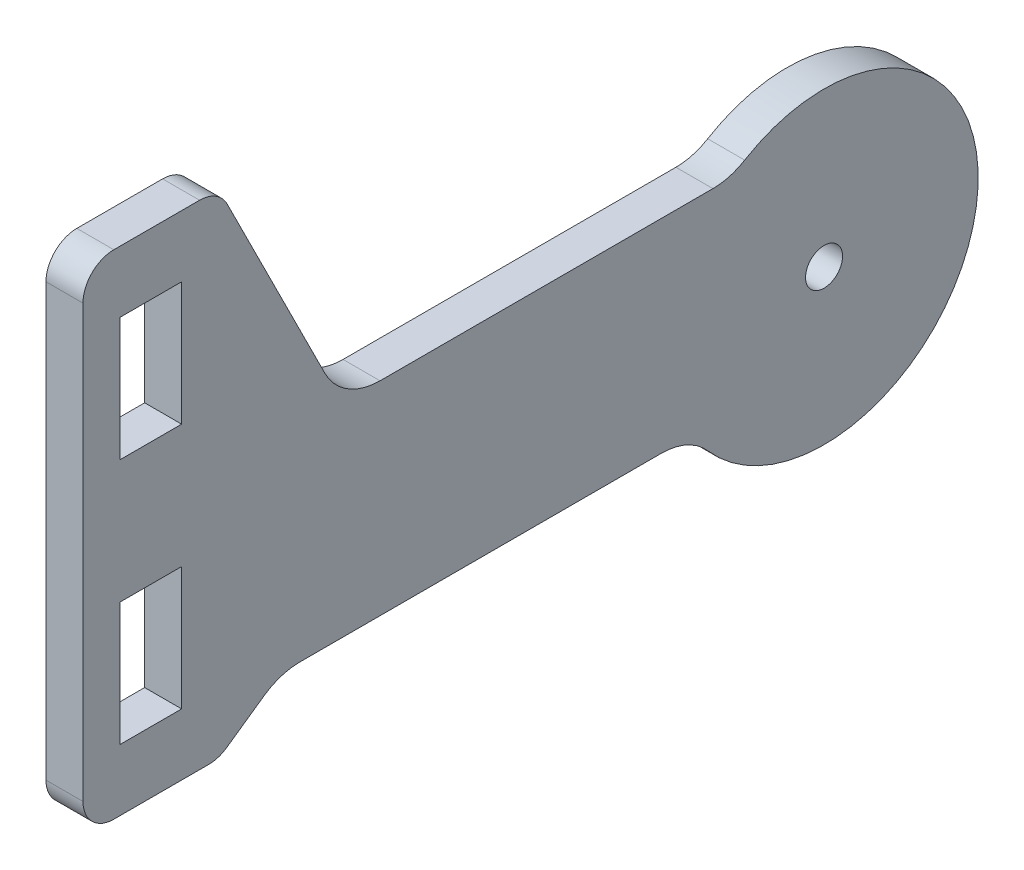
ISO-10303-21;
HEADER;
FILE_DESCRIPTION(('STEP AP214'),'2;1');
FILE_NAME('part.step','',(''),(''),'','','');
FILE_SCHEMA(('AUTOMOTIVE_DESIGN { 1 0 10303 214 1 1 1 1 }'));
ENDSEC;
DATA;
#1=APPLICATION_CONTEXT('core data for automotive mechanical design processes');
#2=APPLICATION_PROTOCOL_DEFINITION('international standard','automotive_design',2000,#1);
#3=PRODUCT_CONTEXT('',#1,'mechanical');
#4=PRODUCT('Part','Part','',(#3));
#5=PRODUCT_RELATED_PRODUCT_CATEGORY('part','',(#4));
#6=PRODUCT_DEFINITION_FORMATION('','',#4);
#7=PRODUCT_DEFINITION_CONTEXT('part definition',#1,'design');
#8=PRODUCT_DEFINITION('design','',#6,#7);
#9=PRODUCT_DEFINITION_SHAPE('','',#8);
#10=(LENGTH_UNIT() NAMED_UNIT(*) SI_UNIT(.MILLI.,.METRE.));
#11=(NAMED_UNIT(*) PLANE_ANGLE_UNIT() SI_UNIT($,.RADIAN.));
#12=(NAMED_UNIT(*) SI_UNIT($,.STERADIAN.) SOLID_ANGLE_UNIT());
#13=UNCERTAINTY_MEASURE_WITH_UNIT(LENGTH_MEASURE(1.E-05),#10,'distance_accuracy_value','');
#14=(GEOMETRIC_REPRESENTATION_CONTEXT(3) GLOBAL_UNCERTAINTY_ASSIGNED_CONTEXT((#13)) GLOBAL_UNIT_ASSIGNED_CONTEXT((#10,
#11,#12)) REPRESENTATION_CONTEXT('',''));
#15=CARTESIAN_POINT('',(0.,0.,0.));
#16=DIRECTION('',(0.,0.,1.));
#17=DIRECTION('',(1.,0.,0.));
#18=AXIS2_PLACEMENT_3D('',#15,#16,#17);
#19=CARTESIAN_POINT('',(1.5,-7.5,49.8880555770477));
#20=DIRECTION('',(1.,0.,0.));
#21=DIRECTION('',(0.,0.,-1.));
#22=AXIS2_PLACEMENT_3D('',#19,#20,#21);
#23=CYLINDRICAL_SURFACE('',#22,2.5);
#24=CARTESIAN_POINT('',(-1.5,-7.5,49.8880555770477));
#25=DIRECTION('',(1.,0.,0.));
#26=DIRECTION('',(0.,0.,-1.));
#27=AXIS2_PLACEMENT_3D('',#24,#25,#26);
#28=CIRCLE('',#27,2.5);
#29=CARTESIAN_POINT('',(-1.5,-10.,49.8880555770477));
#30=VERTEX_POINT('',#29);
#31=CARTESIAN_POINT('',(-1.5,-9.5480798012976,48.4543997161394));
#32=VERTEX_POINT('',#31);
#33=EDGE_CURVE('E11',#30,#32,#28,.T.);
#34=ORIENTED_EDGE('',*,*,#33,.T.);
#35=DIRECTION('',(1.,0.,0.));
#36=VECTOR('',#35,1.);
#37=CARTESIAN_POINT('',(1.5,-9.5480798012976,48.4543997161394));
#38=LINE('',#37,#36);
#39=CARTESIAN_POINT('',(1.5,-9.5480798012976,48.4543997161394));
#40=VERTEX_POINT('',#39);
#41=EDGE_CURVE('E24',#32,#40,#38,.T.);
#42=ORIENTED_EDGE('',*,*,#41,.T.);
#43=CARTESIAN_POINT('',(1.5,-7.5,49.8880555770477));
#44=DIRECTION('',(1.,0.,0.));
#45=DIRECTION('',(0.,0.,-1.));
#46=AXIS2_PLACEMENT_3D('',#43,#44,#45);
#47=CIRCLE('',#46,2.5);
#48=CARTESIAN_POINT('',(1.5,-10.,49.8880555770477));
#49=VERTEX_POINT('',#48);
#50=EDGE_CURVE('E375',#40,#49,#47,.F.);
#51=ORIENTED_EDGE('',*,*,#50,.T.);
#52=DIRECTION('',(1.,0.,0.));
#53=VECTOR('',#52,1.);
#54=CARTESIAN_POINT('',(1.5,-10.,49.8880555770477));
#55=LINE('',#54,#53);
#56=EDGE_CURVE('E372',#30,#49,#55,.T.);
#57=ORIENTED_EDGE('',*,*,#56,.F.);
#58=EDGE_LOOP('',(#34,#42,#51,#57));
#59=FACE_BOUND('',#58,.T.);
#60=ADVANCED_FACE('F17',(#59),#23,.T.);
#61=CARTESIAN_POINT('',(-1.5,0.,0.));
#62=DIRECTION('',(1.,0.,0.));
#63=DIRECTION('',(0.,0.,-1.));
#64=AXIS2_PLACEMENT_3D('',#61,#62,#63);
#65=PLANE('',#64);
#66=CARTESIAN_POINT('',(-1.5,0.,0.));
#67=DIRECTION('',(-1.,0.,0.));
#68=DIRECTION('',(0.,0.,1.));
#69=AXIS2_PLACEMENT_3D('',#66,#67,#68);
#70=CIRCLE('',#69,1.5);
#71=CARTESIAN_POINT('',(-1.5,0.,1.5));
#72=VERTEX_POINT('',#71);
#73=EDGE_CURVE('E369',#72,#72,#70,.F.);
#74=ORIENTED_EDGE('',*,*,#73,.T.);
#75=EDGE_LOOP('',(#74));
#76=FACE_BOUND('',#75,.T.);
#77=DIRECTION('',(0.,0.,1.));
#78=VECTOR('',#77,1.);
#79=CARTESIAN_POINT('',(-1.5,5.00000000000001,0.));
#80=LINE('',#79,#78);
#81=CARTESIAN_POINT('',(-1.5,5.00000000000001,52.1));
#82=VERTEX_POINT('',#81);
#83=CARTESIAN_POINT('',(-1.5,5.00000000000001,57.1));
#84=VERTEX_POINT('',#83);
#85=EDGE_CURVE('E367',#82,#84,#80,.T.);
#86=ORIENTED_EDGE('',*,*,#85,.T.);
#87=DIRECTION('',(0.,1.,0.));
#88=VECTOR('',#87,1.);
#89=CARTESIAN_POINT('',(-1.5,0.,57.1));
#90=LINE('',#89,#88);
#91=CARTESIAN_POINT('',(-1.5,-4.99999999999999,57.1));
#92=VERTEX_POINT('',#91);
#93=EDGE_CURVE('E181',#84,#92,#90,.F.);
#94=ORIENTED_EDGE('',*,*,#93,.T.);
#95=DIRECTION('',(0.,0.,1.));
#96=VECTOR('',#95,1.);
#97=CARTESIAN_POINT('',(-1.5,-4.99999999999999,0.));
#98=LINE('',#97,#96);
#99=CARTESIAN_POINT('',(-1.5,-4.99999999999999,52.1));
#100=VERTEX_POINT('',#99);
#101=EDGE_CURVE('E363',#100,#92,#98,.T.);
#102=ORIENTED_EDGE('',*,*,#101,.F.);
#103=DIRECTION('',(0.,1.,0.));
#104=VECTOR('',#103,1.);
#105=CARTESIAN_POINT('',(-1.5,0.,52.1));
#106=LINE('',#105,#104);
#107=EDGE_CURVE('E360',#82,#100,#106,.F.);
#108=ORIENTED_EDGE('',*,*,#107,.F.);
#109=EDGE_LOOP('',(#86,#94,#102,#108));
#110=FACE_BOUND('',#109,.T.);
#111=DIRECTION('',(0.,0.,1.));
#112=VECTOR('',#111,1.);
#113=CARTESIAN_POINT('',(-1.5,15.,0.));
#114=LINE('',#113,#112);
#115=CARTESIAN_POINT('',(-1.5,15.,52.1));
#116=VERTEX_POINT('',#115);
#117=CARTESIAN_POINT('',(-1.5,15.,57.1));
#118=VERTEX_POINT('',#117);
#119=EDGE_CURVE('E357',#116,#118,#114,.T.);
#120=ORIENTED_EDGE('',*,*,#119,.F.);
#121=DIRECTION('',(0.,1.,0.));
#122=VECTOR('',#121,1.);
#123=CARTESIAN_POINT('',(-1.5,0.,52.1));
#124=LINE('',#123,#122);
#125=CARTESIAN_POINT('',(-1.5,25.,52.1));
#126=VERTEX_POINT('',#125);
#127=EDGE_CURVE('E355',#116,#126,#124,.T.);
#128=ORIENTED_EDGE('',*,*,#127,.T.);
#129=DIRECTION('',(0.,0.,1.));
#130=VECTOR('',#129,1.);
#131=CARTESIAN_POINT('',(-1.5,25.,0.));
#132=LINE('',#131,#130);
#133=CARTESIAN_POINT('',(-1.5,25.,57.1));
#134=VERTEX_POINT('',#133);
#135=EDGE_CURVE('E353',#126,#134,#132,.T.);
#136=ORIENTED_EDGE('',*,*,#135,.T.);
#137=DIRECTION('',(0.,1.,0.));
#138=VECTOR('',#137,1.);
#139=CARTESIAN_POINT('',(-1.5,0.,57.1));
#140=LINE('',#139,#138);
#141=EDGE_CURVE('E350',#118,#134,#140,.T.);
#142=ORIENTED_EDGE('',*,*,#141,.F.);
#143=EDGE_LOOP('',(#120,#128,#136,#142));
#144=FACE_BOUND('',#143,.T.);
#145=ORIENTED_EDGE('',*,*,#33,.F.);
#146=DIRECTION('',(0.,0.,-1.));
#147=VECTOR('',#146,1.);
#148=CARTESIAN_POINT('',(-1.5,-10.,0.));
#149=LINE('',#148,#147);
#150=CARTESIAN_POINT('',(-1.5,-10.,57.6));
#151=VERTEX_POINT('',#150);
#152=EDGE_CURVE('E347',#151,#30,#149,.T.);
#153=ORIENTED_EDGE('',*,*,#152,.F.);
#154=CARTESIAN_POINT('',(-1.5,-7.5,57.6));
#155=DIRECTION('',(1.,0.,0.));
#156=DIRECTION('',(0.,0.,-1.));
#157=AXIS2_PLACEMENT_3D('',#154,#155,#156);
#158=CIRCLE('',#157,2.5);
#159=CARTESIAN_POINT('',(-1.5,-7.5,60.1));
#160=VERTEX_POINT('',#159);
#161=EDGE_CURVE('E344',#160,#151,#158,.T.);
#162=ORIENTED_EDGE('',*,*,#161,.F.);
#163=DIRECTION('',(0.,1.,0.));
#164=VECTOR('',#163,1.);
#165=CARTESIAN_POINT('',(-1.5,0.,60.1));
#166=LINE('',#165,#164);
#167=CARTESIAN_POINT('',(-1.5,27.5,60.1));
#168=VERTEX_POINT('',#167);
#169=EDGE_CURVE('E342',#160,#168,#166,.T.);
#170=ORIENTED_EDGE('',*,*,#169,.T.);
#171=CARTESIAN_POINT('',(-1.5,27.5,57.6));
#172=DIRECTION('',(-1.,0.,0.));
#173=DIRECTION('',(0.,0.,1.));
#174=AXIS2_PLACEMENT_3D('',#171,#172,#173);
#175=CIRCLE('',#174,2.5);
#176=CARTESIAN_POINT('',(-1.5,30.,57.6));
#177=VERTEX_POINT('',#176);
#178=EDGE_CURVE('E339',#177,#168,#175,.F.);
#179=ORIENTED_EDGE('',*,*,#178,.F.);
#180=DIRECTION('',(0.,0.,-1.));
#181=VECTOR('',#180,1.);
#182=CARTESIAN_POINT('',(-1.5,30.,0.));
#183=LINE('',#182,#181);
#184=CARTESIAN_POINT('',(-1.5,30.,50.6450849718747));
#185=VERTEX_POINT('',#184);
#186=EDGE_CURVE('E337',#177,#185,#183,.T.);
#187=ORIENTED_EDGE('',*,*,#186,.T.);
#188=CARTESIAN_POINT('',(-1.5,27.5,50.6450849718747));
#189=DIRECTION('',(1.,0.,0.));
#190=DIRECTION('',(0.,0.,-1.));
#191=AXIS2_PLACEMENT_3D('',#188,#189,#190);
#192=CIRCLE('',#191,2.5);
#193=CARTESIAN_POINT('',(-1.5,28.6180339887499,48.4090169943749));
#194=VERTEX_POINT('',#193);
#195=EDGE_CURVE('E334',#194,#185,#192,.T.);
#196=ORIENTED_EDGE('',*,*,#195,.F.);
#197=DIRECTION('',(0.,0.894427190999916,0.447213595499958));
#198=VECTOR('',#197,1.);
#199=CARTESIAN_POINT('',(-1.5,-13.64,27.28));
#200=LINE('',#199,#198);
#201=CARTESIAN_POINT('',(-1.5,12.7639320225002,40.4819660112501));
#202=VERTEX_POINT('',#201);
#203=EDGE_CURVE('E331',#202,#194,#200,.T.);
#204=ORIENTED_EDGE('',*,*,#203,.F.);
#205=CARTESIAN_POINT('',(-1.5,15.,36.0098300562505));
#206=DIRECTION('',(1.,0.,0.));
#207=DIRECTION('',(0.,0.,-1.));
#208=AXIS2_PLACEMENT_3D('',#205,#206,#207);
#209=CIRCLE('',#208,5.);
#210=CARTESIAN_POINT('',(-1.5,9.99999999999999,36.0098300562505));
#211=VERTEX_POINT('',#210);
#212=EDGE_CURVE('E329',#202,#211,#209,.T.);
#213=ORIENTED_EDGE('',*,*,#212,.T.);
#214=DIRECTION('',(0.,0.,1.));
#215=VECTOR('',#214,1.);
#216=CARTESIAN_POINT('',(-1.5,10.,0.));
#217=LINE('',#216,#215);
#218=CARTESIAN_POINT('',(-1.5,10.,9.01387818865997));
#219=VERTEX_POINT('',#218);
#220=EDGE_CURVE('E326',#219,#211,#217,.T.);
#221=ORIENTED_EDGE('',*,*,#220,.F.);
#222=CARTESIAN_POINT('',(-1.5,15.,9.01387818865997));
#223=DIRECTION('',(-1.,0.,0.));
#224=DIRECTION('',(0.,0.,1.));
#225=AXIS2_PLACEMENT_3D('',#222,#223,#224);
#226=CIRCLE('',#225,5.);
#227=CARTESIAN_POINT('',(-1.5,10.7142857142857,6.43848442047141));
#228=VERTEX_POINT('',#227);
#229=EDGE_CURVE('E324',#219,#228,#226,.F.);
#230=ORIENTED_EDGE('',*,*,#229,.T.);
#231=CARTESIAN_POINT('',(-1.5,0.,0.));
#232=DIRECTION('',(-1.,0.,0.));
#233=DIRECTION('',(0.,0.,1.));
#234=AXIS2_PLACEMENT_3D('',#231,#232,#233);
#235=CIRCLE('',#234,12.5);
#236=CARTESIAN_POINT('',(-1.5,-8.21428571428572,9.42207568448066));
#237=VERTEX_POINT('',#236);
#238=EDGE_CURVE('E321',#237,#228,#235,.F.);
#239=ORIENTED_EDGE('',*,*,#238,.F.);
#240=CARTESIAN_POINT('',(-1.5,-11.5,13.1909059582729));
#241=DIRECTION('',(-1.,0.,0.));
#242=DIRECTION('',(0.,0.,1.));
#243=AXIS2_PLACEMENT_3D('',#240,#241,#242);
#244=CIRCLE('',#243,5.);
#245=CARTESIAN_POINT('',(-1.5,-6.5,13.1909059582729));
#246=VERTEX_POINT('',#245);
#247=EDGE_CURVE('E319',#237,#246,#244,.F.);
#248=ORIENTED_EDGE('',*,*,#247,.T.);
#249=DIRECTION('',(0.,0.,1.));
#250=VECTOR('',#249,1.);
#251=CARTESIAN_POINT('',(-1.5,-6.5,0.));
#252=LINE('',#251,#250);
#253=CARTESIAN_POINT('',(-1.5,-6.50000000000001,42.5238888459045));
#254=VERTEX_POINT('',#253);
#255=EDGE_CURVE('E317',#246,#254,#252,.T.);
#256=ORIENTED_EDGE('',*,*,#255,.T.);
#257=CARTESIAN_POINT('',(-1.5,-11.5,42.5238888459045));
#258=DIRECTION('',(1.,0.,0.));
#259=DIRECTION('',(0.,0.,-1.));
#260=AXIS2_PLACEMENT_3D('',#257,#258,#259);
#261=CIRCLE('',#260,5.);
#262=CARTESIAN_POINT('',(-1.5,-7.40384039740481,45.3912005677211));
#263=VERTEX_POINT('',#262);
#264=EDGE_CURVE('E315',#254,#263,#261,.T.);
#265=ORIENTED_EDGE('',*,*,#264,.T.);
#266=DIRECTION('',(0.,-0.573462344363328,0.819231920519041));
#267=VECTOR('',#266,1.);
#268=CARTESIAN_POINT('',(-1.5,16.3557046979866,11.4489932885906));
#269=LINE('',#268,#267);
#270=EDGE_CURVE('E313',#263,#32,#269,.T.);
#271=ORIENTED_EDGE('',*,*,#270,.T.);
#272=EDGE_LOOP('',(#145,#153,#162,#170,#179,#187,#196,#204,#213,#221,#230,#239,#248,#256,#265,#271));
#273=FACE_BOUND('',#272,.T.);
#274=ADVANCED_FACE('F387',(#76,#110,#144,#273),#65,.F.);
#275=CARTESIAN_POINT('',(1.5,-10.,0.));
#276=DIRECTION('',(0.,-1.,0.));
#277=DIRECTION('',(0.,0.,-1.));
#278=AXIS2_PLACEMENT_3D('',#275,#276,#277);
#279=PLANE('',#278);
#280=DIRECTION('',(0.,0.,-1.));
#281=VECTOR('',#280,1.);
#282=CARTESIAN_POINT('',(1.5,-10.,0.));
#283=LINE('',#282,#281);
#284=CARTESIAN_POINT('',(1.5,-10.,57.6));
#285=VERTEX_POINT('',#284);
#286=EDGE_CURVE('E310',#285,#49,#283,.T.);
#287=ORIENTED_EDGE('',*,*,#286,.F.);
#288=DIRECTION('',(1.,0.,0.));
#289=VECTOR('',#288,1.);
#290=CARTESIAN_POINT('',(1.5,-10.,57.6));
#291=LINE('',#290,#289);
#292=EDGE_CURVE('E307',#151,#285,#291,.T.);
#293=ORIENTED_EDGE('',*,*,#292,.F.);
#294=ORIENTED_EDGE('',*,*,#152,.T.);
#295=ORIENTED_EDGE('',*,*,#56,.T.);
#296=EDGE_LOOP('',(#287,#293,#294,#295));
#297=FACE_BOUND('',#296,.T.);
#298=ADVANCED_FACE('F379',(#297),#279,.T.);
#299=CARTESIAN_POINT('',(1.5,16.3557046979866,11.4489932885906));
#300=DIRECTION('',(0.,0.819231920519041,0.573462344363328));
#301=DIRECTION('',(0.,-0.573462344363328,0.819231920519041));
#302=AXIS2_PLACEMENT_3D('',#299,#300,#301);
#303=PLANE('',#302);
#304=DIRECTION('',(1.,0.,0.));
#305=VECTOR('',#304,1.);
#306=CARTESIAN_POINT('',(1.5,-7.40384039740481,45.3912005677211));
#307=LINE('',#306,#305);
#308=CARTESIAN_POINT('',(1.5,-7.40384039740481,45.3912005677211));
#309=VERTEX_POINT('',#308);
#310=EDGE_CURVE('E305',#263,#309,#307,.T.);
#311=ORIENTED_EDGE('',*,*,#310,.T.);
#312=DIRECTION('',(0.,0.573462344363328,-0.81923192051904));
#313=VECTOR('',#312,1.);
#314=CARTESIAN_POINT('',(1.5,-9.54807980129761,48.4543997161394));
#315=LINE('',#314,#313);
#316=EDGE_CURVE('E302',#40,#309,#315,.T.);
#317=ORIENTED_EDGE('',*,*,#316,.F.);
#318=ORIENTED_EDGE('',*,*,#41,.F.);
#319=ORIENTED_EDGE('',*,*,#270,.F.);
#320=EDGE_LOOP('',(#311,#317,#318,#319));
#321=FACE_BOUND('',#320,.T.);
#322=ADVANCED_FACE('F438',(#321),#303,.F.);
#323=CARTESIAN_POINT('',(1.5,-11.5,42.5238888459045));
#324=DIRECTION('',(1.,0.,0.));
#325=DIRECTION('',(0.,0.,-1.));
#326=AXIS2_PLACEMENT_3D('',#323,#324,#325);
#327=CYLINDRICAL_SURFACE('',#326,5.);
#328=ORIENTED_EDGE('',*,*,#310,.F.);
#329=ORIENTED_EDGE('',*,*,#264,.F.);
#330=DIRECTION('',(1.,0.,0.));
#331=VECTOR('',#330,1.);
#332=CARTESIAN_POINT('',(1.5,-6.50000000000001,42.5238888459045));
#333=LINE('',#332,#331);
#334=CARTESIAN_POINT('',(1.5,-6.50000000000001,42.5238888459045));
#335=VERTEX_POINT('',#334);
#336=EDGE_CURVE('E300',#254,#335,#333,.T.);
#337=ORIENTED_EDGE('',*,*,#336,.T.);
#338=CARTESIAN_POINT('',(1.5,-11.5,42.5238888459045));
#339=DIRECTION('',(1.,0.,0.));
#340=DIRECTION('',(0.,0.,-1.));
#341=AXIS2_PLACEMENT_3D('',#338,#339,#340);
#342=CIRCLE('',#341,5.);
#343=EDGE_CURVE('E297',#309,#335,#342,.F.);
#344=ORIENTED_EDGE('',*,*,#343,.F.);
#345=EDGE_LOOP('',(#328,#329,#337,#344));
#346=FACE_BOUND('',#345,.T.);
#347=ADVANCED_FACE('F435',(#346),#327,.F.);
#348=CARTESIAN_POINT('',(1.5,-6.5,0.));
#349=DIRECTION('',(0.,1.,0.));
#350=DIRECTION('',(0.,0.,1.));
#351=AXIS2_PLACEMENT_3D('',#348,#349,#350);
#352=PLANE('',#351);
#353=DIRECTION('',(-1.,0.,0.));
#354=VECTOR('',#353,1.);
#355=CARTESIAN_POINT('',(1.5,-6.5,13.1909059582729));
#356=LINE('',#355,#354);
#357=CARTESIAN_POINT('',(1.5,-6.5,13.1909059582729));
#358=VERTEX_POINT('',#357);
#359=EDGE_CURVE('E295',#246,#358,#356,.F.);
#360=ORIENTED_EDGE('',*,*,#359,.T.);
#361=DIRECTION('',(0.,0.,-1.));
#362=VECTOR('',#361,1.);
#363=CARTESIAN_POINT('',(1.5,-6.50000000000001,0.));
#364=LINE('',#363,#362);
#365=EDGE_CURVE('E292',#335,#358,#364,.T.);
#366=ORIENTED_EDGE('',*,*,#365,.F.);
#367=ORIENTED_EDGE('',*,*,#336,.F.);
#368=ORIENTED_EDGE('',*,*,#255,.F.);
#369=EDGE_LOOP('',(#360,#366,#367,#368));
#370=FACE_BOUND('',#369,.T.);
#371=ADVANCED_FACE('F430',(#370),#352,.F.);
#372=CARTESIAN_POINT('',(1.5,-11.5,13.1909059582729));
#373=DIRECTION('',(-1.,0.,0.));
#374=DIRECTION('',(0.,0.,1.));
#375=AXIS2_PLACEMENT_3D('',#372,#373,#374);
#376=CYLINDRICAL_SURFACE('',#375,5.);
#377=ORIENTED_EDGE('',*,*,#359,.F.);
#378=ORIENTED_EDGE('',*,*,#247,.F.);
#379=DIRECTION('',(-1.,0.,0.));
#380=VECTOR('',#379,1.);
#381=CARTESIAN_POINT('',(1.5,-8.21428571428571,9.42207568448066));
#382=LINE('',#381,#380);
#383=CARTESIAN_POINT('',(1.5,-8.21428571428572,9.42207568448066));
#384=VERTEX_POINT('',#383);
#385=EDGE_CURVE('E289',#384,#237,#382,.T.);
#386=ORIENTED_EDGE('',*,*,#385,.F.);
#387=CARTESIAN_POINT('',(1.5,-11.5,13.1909059582729));
#388=DIRECTION('',(-1.,0.,0.));
#389=DIRECTION('',(0.,0.,1.));
#390=AXIS2_PLACEMENT_3D('',#387,#388,#389);
#391=CIRCLE('',#390,5.);
#392=EDGE_CURVE('E286',#358,#384,#391,.T.);
#393=ORIENTED_EDGE('',*,*,#392,.F.);
#394=EDGE_LOOP('',(#377,#378,#386,#393));
#395=FACE_BOUND('',#394,.T.);
#396=ADVANCED_FACE('F425',(#395),#376,.F.);
#397=CARTESIAN_POINT('',(1.5,0.,0.));
#398=DIRECTION('',(-1.,0.,0.));
#399=DIRECTION('',(0.,0.,1.));
#400=AXIS2_PLACEMENT_3D('',#397,#398,#399);
#401=CYLINDRICAL_SURFACE('',#400,12.5);
#402=CARTESIAN_POINT('',(1.5,0.,0.));
#403=DIRECTION('',(-1.,0.,0.));
#404=DIRECTION('',(0.,0.,1.));
#405=AXIS2_PLACEMENT_3D('',#402,#403,#404);
#406=CIRCLE('',#405,12.5);
#407=CARTESIAN_POINT('',(1.5,10.7142857142857,6.43848442047141));
#408=VERTEX_POINT('',#407);
#409=EDGE_CURVE('E283',#384,#408,#406,.F.);
#410=ORIENTED_EDGE('',*,*,#409,.F.);
#411=ORIENTED_EDGE('',*,*,#385,.T.);
#412=ORIENTED_EDGE('',*,*,#238,.T.);
#413=DIRECTION('',(-1.,0.,0.));
#414=VECTOR('',#413,1.);
#415=CARTESIAN_POINT('',(1.5,10.7142857142857,6.43848442047141));
#416=LINE('',#415,#414);
#417=EDGE_CURVE('E281',#228,#408,#416,.F.);
#418=ORIENTED_EDGE('',*,*,#417,.T.);
#419=EDGE_LOOP('',(#410,#411,#412,#418));
#420=FACE_BOUND('',#419,.T.);
#421=ADVANCED_FACE('F421',(#420),#401,.T.);
#422=CARTESIAN_POINT('',(1.5,15.,9.01387818865997));
#423=DIRECTION('',(-1.,0.,0.));
#424=DIRECTION('',(0.,0.,1.));
#425=AXIS2_PLACEMENT_3D('',#422,#423,#424);
#426=CYLINDRICAL_SURFACE('',#425,5.);
#427=ORIENTED_EDGE('',*,*,#417,.F.);
#428=ORIENTED_EDGE('',*,*,#229,.F.);
#429=DIRECTION('',(1.,0.,0.));
#430=VECTOR('',#429,1.);
#431=CARTESIAN_POINT('',(1.5,10.,9.01387818865997));
#432=LINE('',#431,#430);
#433=CARTESIAN_POINT('',(1.5,10.,9.01387818865997));
#434=VERTEX_POINT('',#433);
#435=EDGE_CURVE('E278',#434,#219,#432,.F.);
#436=ORIENTED_EDGE('',*,*,#435,.F.);
#437=CARTESIAN_POINT('',(1.5,15.,9.01387818865997));
#438=DIRECTION('',(-1.,0.,0.));
#439=DIRECTION('',(0.,0.,1.));
#440=AXIS2_PLACEMENT_3D('',#437,#438,#439);
#441=CIRCLE('',#440,5.);
#442=EDGE_CURVE('E275',#408,#434,#441,.T.);
#443=ORIENTED_EDGE('',*,*,#442,.F.);
#444=EDGE_LOOP('',(#427,#428,#436,#443));
#445=FACE_BOUND('',#444,.T.);
#446=ADVANCED_FACE('F417',(#445),#426,.F.);
#447=CARTESIAN_POINT('',(1.5,10.,0.));
#448=DIRECTION('',(0.,1.,0.));
#449=DIRECTION('',(0.,0.,1.));
#450=AXIS2_PLACEMENT_3D('',#447,#448,#449);
#451=PLANE('',#450);
#452=DIRECTION('',(0.,0.,-1.));
#453=VECTOR('',#452,1.);
#454=CARTESIAN_POINT('',(1.5,10.,0.));
#455=LINE('',#454,#453);
#456=CARTESIAN_POINT('',(1.5,10.,36.0098300562505));
#457=VERTEX_POINT('',#456);
#458=EDGE_CURVE('E272',#434,#457,#455,.F.);
#459=ORIENTED_EDGE('',*,*,#458,.F.);
#460=ORIENTED_EDGE('',*,*,#435,.T.);
#461=ORIENTED_EDGE('',*,*,#220,.T.);
#462=DIRECTION('',(1.,0.,0.));
#463=VECTOR('',#462,1.);
#464=CARTESIAN_POINT('',(1.5,9.99999999999999,36.0098300562505));
#465=LINE('',#464,#463);
#466=EDGE_CURVE('E270',#211,#457,#465,.T.);
#467=ORIENTED_EDGE('',*,*,#466,.T.);
#468=EDGE_LOOP('',(#459,#460,#461,#467));
#469=FACE_BOUND('',#468,.T.);
#470=ADVANCED_FACE('F413',(#469),#451,.T.);
#471=CARTESIAN_POINT('',(1.5,15.,36.0098300562505));
#472=DIRECTION('',(1.,0.,0.));
#473=DIRECTION('',(0.,0.,-1.));
#474=AXIS2_PLACEMENT_3D('',#471,#472,#473);
#475=CYLINDRICAL_SURFACE('',#474,5.);
#476=ORIENTED_EDGE('',*,*,#466,.F.);
#477=ORIENTED_EDGE('',*,*,#212,.F.);
#478=DIRECTION('',(1.,0.,0.));
#479=VECTOR('',#478,1.);
#480=CARTESIAN_POINT('',(1.5,12.7639320225002,40.4819660112501));
#481=LINE('',#480,#479);
#482=CARTESIAN_POINT('',(1.5,12.7639320225002,40.4819660112501));
#483=VERTEX_POINT('',#482);
#484=EDGE_CURVE('E267',#483,#202,#481,.F.);
#485=ORIENTED_EDGE('',*,*,#484,.F.);
#486=CARTESIAN_POINT('',(1.5,15.,36.0098300562505));
#487=DIRECTION('',(1.,0.,0.));
#488=DIRECTION('',(0.,0.,-1.));
#489=AXIS2_PLACEMENT_3D('',#486,#487,#488);
#490=CIRCLE('',#489,5.);
#491=EDGE_CURVE('E264',#457,#483,#490,.F.);
#492=ORIENTED_EDGE('',*,*,#491,.F.);
#493=EDGE_LOOP('',(#476,#477,#485,#492));
#494=FACE_BOUND('',#493,.T.);
#495=ADVANCED_FACE('F409',(#494),#475,.F.);
#496=CARTESIAN_POINT('',(1.5,-13.64,27.28));
#497=DIRECTION('',(0.,0.447213595499958,-0.894427190999916));
#498=DIRECTION('',(0.,0.894427190999916,0.447213595499958));
#499=AXIS2_PLACEMENT_3D('',#496,#497,#498);
#500=PLANE('',#499);
#501=ORIENTED_EDGE('',*,*,#203,.T.);
#502=DIRECTION('',(1.,0.,0.));
#503=VECTOR('',#502,1.);
#504=CARTESIAN_POINT('',(1.5,28.6180339887499,48.4090169943749));
#505=LINE('',#504,#503);
#506=CARTESIAN_POINT('',(1.5,28.6180339887499,48.4090169943749));
#507=VERTEX_POINT('',#506);
#508=EDGE_CURVE('E261',#507,#194,#505,.F.);
#509=ORIENTED_EDGE('',*,*,#508,.F.);
#510=DIRECTION('',(0.,0.894427190999916,0.447213595499957));
#511=VECTOR('',#510,1.);
#512=CARTESIAN_POINT('',(1.5,12.7639320225002,40.4819660112501));
#513=LINE('',#512,#511);
#514=EDGE_CURVE('E258',#483,#507,#513,.T.);
#515=ORIENTED_EDGE('',*,*,#514,.F.);
#516=ORIENTED_EDGE('',*,*,#484,.T.);
#517=EDGE_LOOP('',(#501,#509,#515,#516));
#518=FACE_BOUND('',#517,.T.);
#519=ADVANCED_FACE('F404',(#518),#500,.T.);
#520=CARTESIAN_POINT('',(1.5,27.5,50.6450849718747));
#521=DIRECTION('',(1.,0.,0.));
#522=DIRECTION('',(0.,0.,-1.));
#523=AXIS2_PLACEMENT_3D('',#520,#521,#522);
#524=CYLINDRICAL_SURFACE('',#523,2.5);
#525=ORIENTED_EDGE('',*,*,#195,.T.);
#526=DIRECTION('',(1.,0.,0.));
#527=VECTOR('',#526,1.);
#528=CARTESIAN_POINT('',(1.5,30.,50.6450849718747));
#529=LINE('',#528,#527);
#530=CARTESIAN_POINT('',(1.5,30.,50.6450849718747));
#531=VERTEX_POINT('',#530);
#532=EDGE_CURVE('E256',#185,#531,#529,.T.);
#533=ORIENTED_EDGE('',*,*,#532,.T.);
#534=CARTESIAN_POINT('',(1.5,27.5,50.6450849718747));
#535=DIRECTION('',(1.,0.,0.));
#536=DIRECTION('',(0.,0.,-1.));
#537=AXIS2_PLACEMENT_3D('',#534,#535,#536);
#538=CIRCLE('',#537,2.5);
#539=EDGE_CURVE('E253',#507,#531,#538,.T.);
#540=ORIENTED_EDGE('',*,*,#539,.F.);
#541=ORIENTED_EDGE('',*,*,#508,.T.);
#542=EDGE_LOOP('',(#525,#533,#540,#541));
#543=FACE_BOUND('',#542,.T.);
#544=ADVANCED_FACE('F401',(#543),#524,.T.);
#545=CARTESIAN_POINT('',(1.5,30.,0.));
#546=DIRECTION('',(0.,-1.,0.));
#547=DIRECTION('',(0.,0.,-1.));
#548=AXIS2_PLACEMENT_3D('',#545,#546,#547);
#549=PLANE('',#548);
#550=ORIENTED_EDGE('',*,*,#532,.F.);
#551=ORIENTED_EDGE('',*,*,#186,.F.);
#552=DIRECTION('',(-1.,0.,0.));
#553=VECTOR('',#552,1.);
#554=CARTESIAN_POINT('',(1.5,30.,57.6));
#555=LINE('',#554,#553);
#556=CARTESIAN_POINT('',(1.5,30.,57.6));
#557=VERTEX_POINT('',#556);
#558=EDGE_CURVE('E250',#557,#177,#555,.T.);
#559=ORIENTED_EDGE('',*,*,#558,.F.);
#560=DIRECTION('',(0.,0.,-1.));
#561=VECTOR('',#560,1.);
#562=CARTESIAN_POINT('',(1.5,30.,0.));
#563=LINE('',#562,#561);
#564=EDGE_CURVE('E247',#531,#557,#563,.F.);
#565=ORIENTED_EDGE('',*,*,#564,.F.);
#566=EDGE_LOOP('',(#550,#551,#559,#565));
#567=FACE_BOUND('',#566,.T.);
#568=ADVANCED_FACE('F397',(#567),#549,.F.);
#569=CARTESIAN_POINT('',(1.5,27.5,57.6));
#570=DIRECTION('',(-1.,0.,0.));
#571=DIRECTION('',(0.,0.,1.));
#572=AXIS2_PLACEMENT_3D('',#569,#570,#571);
#573=CYLINDRICAL_SURFACE('',#572,2.5);
#574=ORIENTED_EDGE('',*,*,#178,.T.);
#575=DIRECTION('',(-1.,0.,0.));
#576=VECTOR('',#575,1.);
#577=CARTESIAN_POINT('',(1.5,27.5,60.1));
#578=LINE('',#577,#576);
#579=CARTESIAN_POINT('',(1.5,27.5,60.1));
#580=VERTEX_POINT('',#579);
#581=EDGE_CURVE('E245',#168,#580,#578,.F.);
#582=ORIENTED_EDGE('',*,*,#581,.T.);
#583=CARTESIAN_POINT('',(1.5,27.5,57.6));
#584=DIRECTION('',(-1.,0.,0.));
#585=DIRECTION('',(0.,0.,1.));
#586=AXIS2_PLACEMENT_3D('',#583,#584,#585);
#587=CIRCLE('',#586,2.5);
#588=EDGE_CURVE('E242',#557,#580,#587,.F.);
#589=ORIENTED_EDGE('',*,*,#588,.F.);
#590=ORIENTED_EDGE('',*,*,#558,.T.);
#591=EDGE_LOOP('',(#574,#582,#589,#590));
#592=FACE_BOUND('',#591,.T.);
#593=ADVANCED_FACE('F393',(#592),#573,.T.);
#594=CARTESIAN_POINT('',(1.5,0.,60.1));
#595=DIRECTION('',(0.,0.,-1.));
#596=DIRECTION('',(-1.,0.,0.));
#597=AXIS2_PLACEMENT_3D('',#594,#595,#596);
#598=PLANE('',#597);
#599=DIRECTION('',(1.,0.,0.));
#600=VECTOR('',#599,1.);
#601=CARTESIAN_POINT('',(1.5,-7.5,60.1));
#602=LINE('',#601,#600);
#603=CARTESIAN_POINT('',(1.5,-7.5,60.1));
#604=VERTEX_POINT('',#603);
#605=EDGE_CURVE('E239',#604,#160,#602,.F.);
#606=ORIENTED_EDGE('',*,*,#605,.F.);
#607=DIRECTION('',(0.,1.,0.));
#608=VECTOR('',#607,1.);
#609=CARTESIAN_POINT('',(1.5,0.,60.1));
#610=LINE('',#609,#608);
#611=EDGE_CURVE('E236',#580,#604,#610,.F.);
#612=ORIENTED_EDGE('',*,*,#611,.F.);
#613=ORIENTED_EDGE('',*,*,#581,.F.);
#614=ORIENTED_EDGE('',*,*,#169,.F.);
#615=EDGE_LOOP('',(#606,#612,#613,#614));
#616=FACE_BOUND('',#615,.T.);
#617=ADVANCED_FACE('F390',(#616),#598,.F.);
#618=CARTESIAN_POINT('',(1.5,-7.5,57.6));
#619=DIRECTION('',(1.,0.,0.));
#620=DIRECTION('',(0.,0.,-1.));
#621=AXIS2_PLACEMENT_3D('',#618,#619,#620);
#622=CYLINDRICAL_SURFACE('',#621,2.5);
#623=ORIENTED_EDGE('',*,*,#161,.T.);
#624=ORIENTED_EDGE('',*,*,#292,.T.);
#625=CARTESIAN_POINT('',(1.5,-7.5,57.6));
#626=DIRECTION('',(1.,0.,0.));
#627=DIRECTION('',(0.,0.,-1.));
#628=AXIS2_PLACEMENT_3D('',#625,#626,#627);
#629=CIRCLE('',#628,2.5);
#630=EDGE_CURVE('E233',#604,#285,#629,.T.);
#631=ORIENTED_EDGE('',*,*,#630,.F.);
#632=ORIENTED_EDGE('',*,*,#605,.T.);
#633=EDGE_LOOP('',(#623,#624,#631,#632));
#634=FACE_BOUND('',#633,.T.);
#635=ADVANCED_FACE('F384',(#634),#622,.T.);
#636=CARTESIAN_POINT('',(1.5,0.,57.1));
#637=DIRECTION('',(0.,0.,-1.));
#638=DIRECTION('',(-1.,0.,0.));
#639=AXIS2_PLACEMENT_3D('',#636,#637,#638);
#640=PLANE('',#639);
#641=DIRECTION('',(0.,1.,0.));
#642=VECTOR('',#641,1.);
#643=CARTESIAN_POINT('',(1.5,0.,57.1));
#644=LINE('',#643,#642);
#645=CARTESIAN_POINT('',(1.5,15.,57.1));
#646=VERTEX_POINT('',#645);
#647=CARTESIAN_POINT('',(1.5,25.,57.1));
#648=VERTEX_POINT('',#647);
#649=EDGE_CURVE('E230',#646,#648,#644,.T.);
#650=ORIENTED_EDGE('',*,*,#649,.F.);
#651=DIRECTION('',(1.,0.,0.));
#652=VECTOR('',#651,1.);
#653=CARTESIAN_POINT('',(1.5,15.,57.1));
#654=LINE('',#653,#652);
#655=EDGE_CURVE('E227',#118,#646,#654,.T.);
#656=ORIENTED_EDGE('',*,*,#655,.F.);
#657=ORIENTED_EDGE('',*,*,#141,.T.);
#658=DIRECTION('',(1.,0.,0.));
#659=VECTOR('',#658,1.);
#660=CARTESIAN_POINT('',(1.5,25.,57.1));
#661=LINE('',#660,#659);
#662=EDGE_CURVE('E225',#134,#648,#661,.T.);
#663=ORIENTED_EDGE('',*,*,#662,.T.);
#664=EDGE_LOOP('',(#650,#656,#657,#663));
#665=FACE_BOUND('',#664,.T.);
#666=ADVANCED_FACE('F475',(#665),#640,.T.);
#667=CARTESIAN_POINT('',(1.5,25.,0.));
#668=DIRECTION('',(0.,1.,0.));
#669=DIRECTION('',(0.,0.,1.));
#670=AXIS2_PLACEMENT_3D('',#667,#668,#669);
#671=PLANE('',#670);
#672=DIRECTION('',(-1.,0.,0.));
#673=VECTOR('',#672,1.);
#674=CARTESIAN_POINT('',(1.5,25.,52.1));
#675=LINE('',#674,#673);
#676=CARTESIAN_POINT('',(1.5,25.,52.1));
#677=VERTEX_POINT('',#676);
#678=EDGE_CURVE('E223',#126,#677,#675,.F.);
#679=ORIENTED_EDGE('',*,*,#678,.T.);
#680=DIRECTION('',(0.,0.,-1.));
#681=VECTOR('',#680,1.);
#682=CARTESIAN_POINT('',(1.5,25.,0.));
#683=LINE('',#682,#681);
#684=EDGE_CURVE('E220',#648,#677,#683,.T.);
#685=ORIENTED_EDGE('',*,*,#684,.F.);
#686=ORIENTED_EDGE('',*,*,#662,.F.);
#687=ORIENTED_EDGE('',*,*,#135,.F.);
#688=EDGE_LOOP('',(#679,#685,#686,#687));
#689=FACE_BOUND('',#688,.T.);
#690=ADVANCED_FACE('F473',(#689),#671,.F.);
#691=CARTESIAN_POINT('',(1.5,0.,52.1));
#692=DIRECTION('',(0.,0.,-1.));
#693=DIRECTION('',(-1.,0.,0.));
#694=AXIS2_PLACEMENT_3D('',#691,#692,#693);
#695=PLANE('',#694);
#696=DIRECTION('',(1.,0.,0.));
#697=VECTOR('',#696,1.);
#698=CARTESIAN_POINT('',(1.5,15.,52.1));
#699=LINE('',#698,#697);
#700=CARTESIAN_POINT('',(1.5,15.,52.1));
#701=VERTEX_POINT('',#700);
#702=EDGE_CURVE('E217',#701,#116,#699,.F.);
#703=ORIENTED_EDGE('',*,*,#702,.F.);
#704=DIRECTION('',(0.,1.,0.));
#705=VECTOR('',#704,1.);
#706=CARTESIAN_POINT('',(1.5,0.,52.1));
#707=LINE('',#706,#705);
#708=EDGE_CURVE('E214',#677,#701,#707,.F.);
#709=ORIENTED_EDGE('',*,*,#708,.F.);
#710=ORIENTED_EDGE('',*,*,#678,.F.);
#711=ORIENTED_EDGE('',*,*,#127,.F.);
#712=EDGE_LOOP('',(#703,#709,#710,#711));
#713=FACE_BOUND('',#712,.T.);
#714=ADVANCED_FACE('F466',(#713),#695,.F.);
#715=CARTESIAN_POINT('',(1.5,15.,0.));
#716=DIRECTION('',(0.,1.,0.));
#717=DIRECTION('',(0.,0.,1.));
#718=AXIS2_PLACEMENT_3D('',#715,#716,#717);
#719=PLANE('',#718);
#720=DIRECTION('',(0.,0.,-1.));
#721=VECTOR('',#720,1.);
#722=CARTESIAN_POINT('',(1.5,15.,0.));
#723=LINE('',#722,#721);
#724=EDGE_CURVE('E211',#701,#646,#723,.F.);
#725=ORIENTED_EDGE('',*,*,#724,.F.);
#726=ORIENTED_EDGE('',*,*,#702,.T.);
#727=ORIENTED_EDGE('',*,*,#119,.T.);
#728=ORIENTED_EDGE('',*,*,#655,.T.);
#729=EDGE_LOOP('',(#725,#726,#727,#728));
#730=FACE_BOUND('',#729,.T.);
#731=ADVANCED_FACE('F469',(#730),#719,.T.);
#732=CARTESIAN_POINT('',(1.5,0.,52.1));
#733=DIRECTION('',(0.,0.,1.));
#734=DIRECTION('',(1.,0.,0.));
#735=AXIS2_PLACEMENT_3D('',#732,#733,#734);
#736=PLANE('',#735);
#737=DIRECTION('',(0.,1.,0.));
#738=VECTOR('',#737,1.);
#739=CARTESIAN_POINT('',(1.5,0.,52.1));
#740=LINE('',#739,#738);
#741=CARTESIAN_POINT('',(1.5,5.00000000000001,52.1));
#742=VERTEX_POINT('',#741);
#743=CARTESIAN_POINT('',(1.5,-4.99999999999999,52.1));
#744=VERTEX_POINT('',#743);
#745=EDGE_CURVE('E209',#742,#744,#740,.F.);
#746=ORIENTED_EDGE('',*,*,#745,.F.);
#747=DIRECTION('',(1.,0.,0.));
#748=VECTOR('',#747,1.);
#749=CARTESIAN_POINT('',(1.5,5.00000000000001,52.1));
#750=LINE('',#749,#748);
#751=EDGE_CURVE('E191',#742,#82,#750,.F.);
#752=ORIENTED_EDGE('',*,*,#751,.T.);
#753=ORIENTED_EDGE('',*,*,#107,.T.);
#754=DIRECTION('',(1.,0.,0.));
#755=VECTOR('',#754,1.);
#756=CARTESIAN_POINT('',(1.5,-4.99999999999999,52.1));
#757=LINE('',#756,#755);
#758=EDGE_CURVE('E205',#744,#100,#757,.F.);
#759=ORIENTED_EDGE('',*,*,#758,.F.);
#760=EDGE_LOOP('',(#746,#752,#753,#759));
#761=FACE_BOUND('',#760,.T.);
#762=ADVANCED_FACE('F590',(#761),#736,.T.);
#763=CARTESIAN_POINT('',(1.5,-4.99999999999999,0.));
#764=DIRECTION('',(0.,1.,0.));
#765=DIRECTION('',(0.,0.,1.));
#766=AXIS2_PLACEMENT_3D('',#763,#764,#765);
#767=PLANE('',#766);
#768=DIRECTION('',(0.,0.,-1.));
#769=VECTOR('',#768,1.);
#770=CARTESIAN_POINT('',(1.5,-4.99999999999999,0.));
#771=LINE('',#770,#769);
#772=CARTESIAN_POINT('',(1.5,-4.99999999999999,57.1));
#773=VERTEX_POINT('',#772);
#774=EDGE_CURVE('E199',#744,#773,#771,.F.);
#775=ORIENTED_EDGE('',*,*,#774,.F.);
#776=ORIENTED_EDGE('',*,*,#758,.T.);
#777=ORIENTED_EDGE('',*,*,#101,.T.);
#778=DIRECTION('',(1.,0.,0.));
#779=VECTOR('',#778,1.);
#780=CARTESIAN_POINT('',(1.5,-4.99999999999999,57.1));
#781=LINE('',#780,#779);
#782=EDGE_CURVE('E184',#92,#773,#781,.T.);
#783=ORIENTED_EDGE('',*,*,#782,.T.);
#784=EDGE_LOOP('',(#775,#776,#777,#783));
#785=FACE_BOUND('',#784,.T.);
#786=ADVANCED_FACE('F600',(#785),#767,.T.);
#787=CARTESIAN_POINT('',(1.5,0.,57.1));
#788=DIRECTION('',(0.,0.,1.));
#789=DIRECTION('',(1.,0.,0.));
#790=AXIS2_PLACEMENT_3D('',#787,#788,#789);
#791=PLANE('',#790);
#792=DIRECTION('',(1.,0.,0.));
#793=VECTOR('',#792,1.);
#794=CARTESIAN_POINT('',(1.5,5.00000000000001,57.1));
#795=LINE('',#794,#793);
#796=CARTESIAN_POINT('',(1.5,5.00000000000001,57.1));
#797=VERTEX_POINT('',#796);
#798=EDGE_CURVE('E174',#84,#797,#795,.T.);
#799=ORIENTED_EDGE('',*,*,#798,.T.);
#800=DIRECTION('',(0.,1.,0.));
#801=VECTOR('',#800,1.);
#802=CARTESIAN_POINT('',(1.5,0.,57.1));
#803=LINE('',#802,#801);
#804=EDGE_CURVE('E179',#773,#797,#803,.T.);
#805=ORIENTED_EDGE('',*,*,#804,.F.);
#806=ORIENTED_EDGE('',*,*,#782,.F.);
#807=ORIENTED_EDGE('',*,*,#93,.F.);
#808=EDGE_LOOP('',(#799,#805,#806,#807));
#809=FACE_BOUND('',#808,.T.);
#810=ADVANCED_FACE('F176',(#809),#791,.F.);
#811=CARTESIAN_POINT('',(1.5,5.00000000000001,0.));
#812=DIRECTION('',(0.,1.,0.));
#813=DIRECTION('',(0.,0.,1.));
#814=AXIS2_PLACEMENT_3D('',#811,#812,#813);
#815=PLANE('',#814);
#816=ORIENTED_EDGE('',*,*,#751,.F.);
#817=DIRECTION('',(0.,0.,-1.));
#818=VECTOR('',#817,1.);
#819=CARTESIAN_POINT('',(1.5,5.00000000000001,0.));
#820=LINE('',#819,#818);
#821=EDGE_CURVE('E188',#797,#742,#820,.T.);
#822=ORIENTED_EDGE('',*,*,#821,.F.);
#823=ORIENTED_EDGE('',*,*,#798,.F.);
#824=ORIENTED_EDGE('',*,*,#85,.F.);
#825=EDGE_LOOP('',(#816,#822,#823,#824));
#826=FACE_BOUND('',#825,.T.);
#827=ADVANCED_FACE('F189',(#826),#815,.F.);
#828=CARTESIAN_POINT('',(1.5,0.,0.));
#829=DIRECTION('',(-1.,0.,0.));
#830=DIRECTION('',(0.,0.,1.));
#831=AXIS2_PLACEMENT_3D('',#828,#829,#830);
#832=CYLINDRICAL_SURFACE('',#831,1.5);
#833=CARTESIAN_POINT('',(1.5,0.,0.));
#834=DIRECTION('',(-1.,0.,0.));
#835=DIRECTION('',(0.,0.,1.));
#836=AXIS2_PLACEMENT_3D('',#833,#834,#835);
#837=CIRCLE('',#836,1.5);
#838=CARTESIAN_POINT('',(1.5,0.,1.5));
#839=VERTEX_POINT('',#838);
#840=EDGE_CURVE('E194',#839,#839,#837,.T.);
#841=ORIENTED_EDGE('',*,*,#840,.F.);
#842=EDGE_LOOP('',(#841));
#843=FACE_BOUND('',#842,.T.);
#844=ORIENTED_EDGE('',*,*,#73,.F.);
#845=EDGE_LOOP('',(#844));
#846=FACE_BOUND('',#845,.T.);
#847=ADVANCED_FACE('F630',(#843,#846),#832,.F.);
#848=CARTESIAN_POINT('',(1.5,0.,0.));
#849=DIRECTION('',(1.,0.,0.));
#850=DIRECTION('',(0.,0.,-1.));
#851=AXIS2_PLACEMENT_3D('',#848,#849,#850);
#852=PLANE('',#851);
#853=ORIENTED_EDGE('',*,*,#840,.T.);
#854=EDGE_LOOP('',(#853));
#855=FACE_BOUND('',#854,.T.);
#856=ORIENTED_EDGE('',*,*,#804,.T.);
#857=ORIENTED_EDGE('',*,*,#821,.T.);
#858=ORIENTED_EDGE('',*,*,#745,.T.);
#859=ORIENTED_EDGE('',*,*,#774,.T.);
#860=EDGE_LOOP('',(#856,#857,#858,#859));
#861=FACE_BOUND('',#860,.T.);
#862=ORIENTED_EDGE('',*,*,#708,.T.);
#863=ORIENTED_EDGE('',*,*,#724,.T.);
#864=ORIENTED_EDGE('',*,*,#649,.T.);
#865=ORIENTED_EDGE('',*,*,#684,.T.);
#866=EDGE_LOOP('',(#862,#863,#864,#865));
#867=FACE_BOUND('',#866,.T.);
#868=ORIENTED_EDGE('',*,*,#611,.T.);
#869=ORIENTED_EDGE('',*,*,#630,.T.);
#870=ORIENTED_EDGE('',*,*,#286,.T.);
#871=ORIENTED_EDGE('',*,*,#50,.F.);
#872=ORIENTED_EDGE('',*,*,#316,.T.);
#873=ORIENTED_EDGE('',*,*,#343,.T.);
#874=ORIENTED_EDGE('',*,*,#365,.T.);
#875=ORIENTED_EDGE('',*,*,#392,.T.);
#876=ORIENTED_EDGE('',*,*,#409,.T.);
#877=ORIENTED_EDGE('',*,*,#442,.T.);
#878=ORIENTED_EDGE('',*,*,#458,.T.);
#879=ORIENTED_EDGE('',*,*,#491,.T.);
#880=ORIENTED_EDGE('',*,*,#514,.T.);
#881=ORIENTED_EDGE('',*,*,#539,.T.);
#882=ORIENTED_EDGE('',*,*,#564,.T.);
#883=ORIENTED_EDGE('',*,*,#588,.T.);
#884=EDGE_LOOP('',(#868,#869,#870,#871,#872,#873,#874,#875,#876,#877,#878,#879,#880,#881,#882,#883));
#885=FACE_BOUND('',#884,.T.);
#886=ADVANCED_FACE('F196',(#855,#861,#867,#885),#852,.T.);
#887=CLOSED_SHELL('',(#60,#274,#298,#322,#347,#371,#396,#421,#446,#470,#495,#519,#544,#568,#593,
#617,#635,#666,#690,#714,#731,#762,#786,#810,#827,#847,#886));
#888=MANIFOLD_SOLID_BREP('B1',#887);
#889=ADVANCED_BREP_SHAPE_REPRESENTATION('',(#18,#888),#14);
#890=SHAPE_DEFINITION_REPRESENTATION(#9,#889);
ENDSEC;
END-ISO-10303-21;
